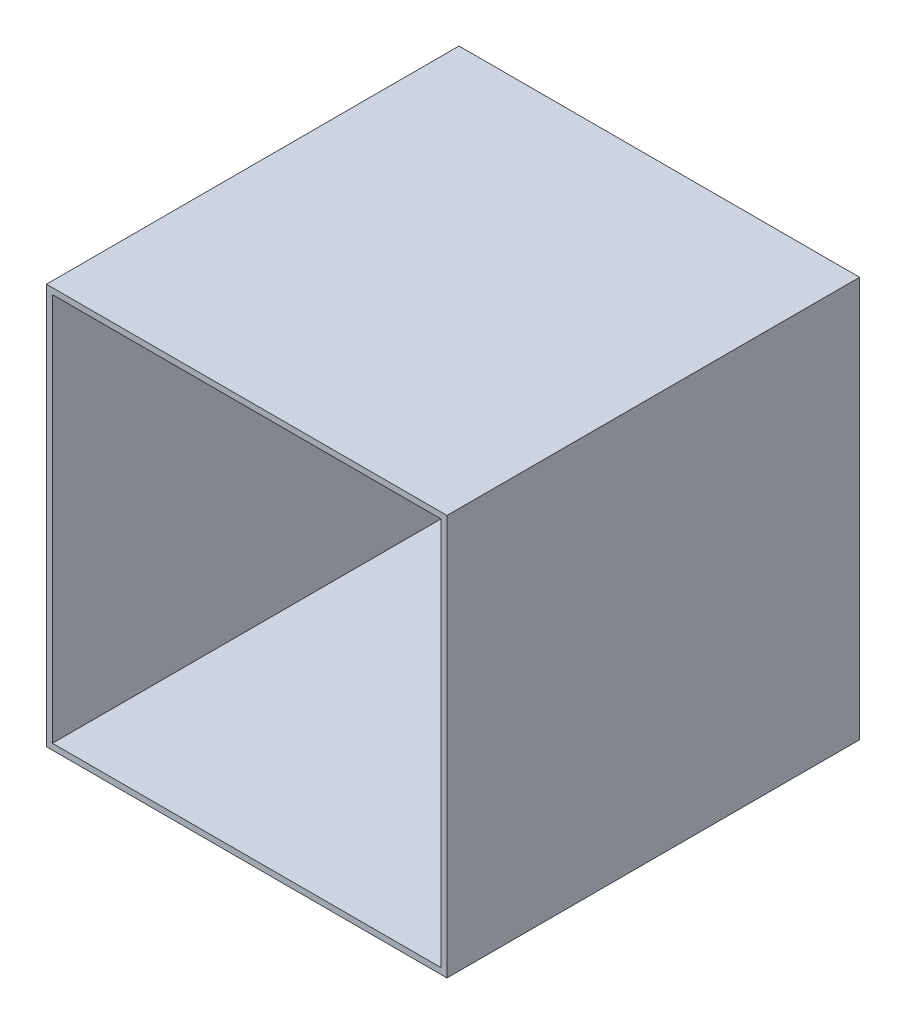
ISO-10303-21;
HEADER;
FILE_DESCRIPTION(('STEP AP214'),'2;1');
FILE_NAME('part.step','',(''),(''),'','','');
FILE_SCHEMA(('AUTOMOTIVE_DESIGN { 1 0 10303 214 1 1 1 1 }'));
ENDSEC;
DATA;
#1=APPLICATION_CONTEXT('core data for automotive mechanical design processes');
#2=APPLICATION_PROTOCOL_DEFINITION('international standard','automotive_design',2000,#1);
#3=PRODUCT_CONTEXT('',#1,'mechanical');
#4=PRODUCT('Part','Part','',(#3));
#5=PRODUCT_RELATED_PRODUCT_CATEGORY('part','',(#4));
#6=PRODUCT_DEFINITION_FORMATION('','',#4);
#7=PRODUCT_DEFINITION_CONTEXT('part definition',#1,'design');
#8=PRODUCT_DEFINITION('design','',#6,#7);
#9=PRODUCT_DEFINITION_SHAPE('','',#8);
#10=(LENGTH_UNIT() NAMED_UNIT(*) SI_UNIT(.MILLI.,.METRE.));
#11=(NAMED_UNIT(*) PLANE_ANGLE_UNIT() SI_UNIT($,.RADIAN.));
#12=(NAMED_UNIT(*) SI_UNIT($,.STERADIAN.) SOLID_ANGLE_UNIT());
#13=UNCERTAINTY_MEASURE_WITH_UNIT(LENGTH_MEASURE(1.E-05),#10,'distance_accuracy_value','');
#14=(GEOMETRIC_REPRESENTATION_CONTEXT(3) GLOBAL_UNCERTAINTY_ASSIGNED_CONTEXT((#13)) GLOBAL_UNIT_ASSIGNED_CONTEXT((#10,
#11,#12)) REPRESENTATION_CONTEXT('',''));
#15=CARTESIAN_POINT('',(0.,0.,0.));
#16=DIRECTION('',(0.,0.,1.));
#17=DIRECTION('',(1.,0.,0.));
#18=AXIS2_PLACEMENT_3D('',#15,#16,#17);
#19=CARTESIAN_POINT('',(-50.,50.,3.));
#20=DIRECTION('',(0.,-1.,0.));
#21=DIRECTION('',(1.,0.,0.));
#22=AXIS2_PLACEMENT_3D('',#19,#20,#21);
#23=PLANE('',#22);
#24=DIRECTION('',(-1.,0.,0.));
#25=VECTOR('',#24,1.);
#26=CARTESIAN_POINT('',(-50.,50.,0.));
#27=LINE('',#26,#25);
#28=CARTESIAN_POINT('',(50.,50.,0.));
#29=VERTEX_POINT('',#28);
#30=CARTESIAN_POINT('',(-50.,50.,0.));
#31=VERTEX_POINT('',#30);
#32=EDGE_CURVE('E255',#29,#31,#27,.T.);
#33=ORIENTED_EDGE('',*,*,#32,.T.);
#34=DIRECTION('',(0.,0.,-1.));
#35=VECTOR('',#34,1.);
#36=CARTESIAN_POINT('',(-50.,50.,3.));
#37=LINE('',#36,#35);
#38=CARTESIAN_POINT('',(-50.,50.,103.));
#39=VERTEX_POINT('',#38);
#40=EDGE_CURVE('E275',#39,#31,#37,.T.);
#41=ORIENTED_EDGE('',*,*,#40,.F.);
#42=DIRECTION('',(-1.,0.,0.));
#43=VECTOR('',#42,1.);
#44=CARTESIAN_POINT('',(-50.,50.,103.));
#45=LINE('',#44,#43);
#46=CARTESIAN_POINT('',(50.,50.,103.));
#47=VERTEX_POINT('',#46);
#48=EDGE_CURVE('E244',#47,#39,#45,.T.);
#49=ORIENTED_EDGE('',*,*,#48,.F.);
#50=DIRECTION('',(0.,0.,-1.));
#51=VECTOR('',#50,1.);
#52=CARTESIAN_POINT('',(50.,50.,3.));
#53=LINE('',#52,#51);
#54=EDGE_CURVE('E263',#47,#29,#53,.T.);
#55=ORIENTED_EDGE('',*,*,#54,.T.);
#56=EDGE_LOOP('',(#33,#41,#49,#55));
#57=FACE_BOUND('',#56,.T.);
#58=ADVANCED_FACE('F39',(#57),#23,.F.);
#59=CARTESIAN_POINT('',(-50.,-50.,3.));
#60=DIRECTION('',(1.,0.,0.));
#61=DIRECTION('',(0.,0.,-1.));
#62=AXIS2_PLACEMENT_3D('',#59,#60,#61);
#63=PLANE('',#62);
#64=DIRECTION('',(0.,-1.,0.));
#65=VECTOR('',#64,1.);
#66=CARTESIAN_POINT('',(-50.,-50.,0.));
#67=LINE('',#66,#65);
#68=CARTESIAN_POINT('',(-50.,-50.,0.));
#69=VERTEX_POINT('',#68);
#70=EDGE_CURVE('E260',#31,#69,#67,.T.);
#71=ORIENTED_EDGE('',*,*,#70,.T.);
#72=DIRECTION('',(0.,0.,-1.));
#73=VECTOR('',#72,1.);
#74=CARTESIAN_POINT('',(-50.,-50.,3.));
#75=LINE('',#74,#73);
#76=CARTESIAN_POINT('',(-50.,-50.,103.));
#77=VERTEX_POINT('',#76);
#78=EDGE_CURVE('E267',#77,#69,#75,.T.);
#79=ORIENTED_EDGE('',*,*,#78,.F.);
#80=DIRECTION('',(0.,-1.,0.));
#81=VECTOR('',#80,1.);
#82=CARTESIAN_POINT('',(-50.,50.,103.));
#83=LINE('',#82,#81);
#84=EDGE_CURVE('E247',#39,#77,#83,.T.);
#85=ORIENTED_EDGE('',*,*,#84,.F.);
#86=ORIENTED_EDGE('',*,*,#40,.T.);
#87=EDGE_LOOP('',(#71,#79,#85,#86));
#88=FACE_BOUND('',#87,.T.);
#89=ADVANCED_FACE('F317',(#88),#63,.F.);
#90=CARTESIAN_POINT('',(-50.,-50.,3.));
#91=DIRECTION('',(0.,1.,0.));
#92=DIRECTION('',(0.,0.,1.));
#93=AXIS2_PLACEMENT_3D('',#90,#91,#92);
#94=PLANE('',#93);
#95=DIRECTION('',(1.,0.,0.));
#96=VECTOR('',#95,1.);
#97=CARTESIAN_POINT('',(19.7957521891708,-50.,6.44000000000001));
#98=LINE('',#97,#96);
#99=CARTESIAN_POINT('',(19.7957521891708,-50.,6.44000000000001));
#100=VERTEX_POINT('',#99);
#101=CARTESIAN_POINT('',(26.8557521891708,-50.,6.44000000000001));
#102=VERTEX_POINT('',#101);
#103=EDGE_CURVE('E162',#100,#102,#98,.T.);
#104=ORIENTED_EDGE('',*,*,#103,.F.);
#105=CARTESIAN_POINT('',(19.7957521891708,-50.,7.72000000000001));
#106=DIRECTION('',(0.,-1.,0.));
#107=DIRECTION('',(0.,0.,-1.));
#108=AXIS2_PLACEMENT_3D('',#105,#106,#107);
#109=CIRCLE('',#108,1.28);
#110=CARTESIAN_POINT('',(19.7957521891708,-50.,9.00000000000001));
#111=VERTEX_POINT('',#110);
#112=EDGE_CURVE('E52',#111,#100,#109,.T.);
#113=ORIENTED_EDGE('',*,*,#112,.F.);
#114=DIRECTION('',(-1.,0.,0.));
#115=VECTOR('',#114,1.);
#116=CARTESIAN_POINT('',(19.7957521891708,-50.,9.00000000000001));
#117=LINE('',#116,#115);
#118=CARTESIAN_POINT('',(26.8557521891708,-50.,9.00000000000001));
#119=VERTEX_POINT('',#118);
#120=EDGE_CURVE('E168',#119,#111,#117,.T.);
#121=ORIENTED_EDGE('',*,*,#120,.F.);
#122=CARTESIAN_POINT('',(26.8557521891708,-50.,7.72000000000001));
#123=DIRECTION('',(0.,-1.,0.));
#124=DIRECTION('',(0.,0.,-1.));
#125=AXIS2_PLACEMENT_3D('',#122,#123,#124);
#126=CIRCLE('',#125,1.28);
#127=EDGE_CURVE('E152',#102,#119,#126,.T.);
#128=ORIENTED_EDGE('',*,*,#127,.F.);
#129=EDGE_LOOP('',(#104,#113,#121,#128));
#130=FACE_BOUND('',#129,.T.);
#131=DIRECTION('',(0.,0.,-1.));
#132=VECTOR('',#131,1.);
#133=CARTESIAN_POINT('',(-12.6584240264876,-50.,4.3));
#134=LINE('',#133,#132);
#135=CARTESIAN_POINT('',(-12.6584240264876,-50.,18.));
#136=VERTEX_POINT('',#135);
#137=CARTESIAN_POINT('',(-12.6584240264876,-50.,4.3));
#138=VERTEX_POINT('',#137);
#139=EDGE_CURVE('E182',#136,#138,#134,.T.);
#140=ORIENTED_EDGE('',*,*,#139,.F.);
#141=DIRECTION('',(-1.,0.,0.));
#142=VECTOR('',#141,1.);
#143=CARTESIAN_POINT('',(-12.6584240264876,-50.,18.));
#144=LINE('',#143,#142);
#145=CARTESIAN_POINT('',(6.14157597351235,-50.,18.));
#146=VERTEX_POINT('',#145);
#147=EDGE_CURVE('E179',#146,#136,#144,.T.);
#148=ORIENTED_EDGE('',*,*,#147,.F.);
#149=DIRECTION('',(0.,0.,1.));
#150=VECTOR('',#149,1.);
#151=CARTESIAN_POINT('',(6.14157597351235,-50.,4.3));
#152=LINE('',#151,#150);
#153=CARTESIAN_POINT('',(6.14157597351235,-50.,4.3));
#154=VERTEX_POINT('',#153);
#155=EDGE_CURVE('E190',#154,#146,#152,.T.);
#156=ORIENTED_EDGE('',*,*,#155,.F.);
#157=DIRECTION('',(1.,0.,0.));
#158=VECTOR('',#157,1.);
#159=CARTESIAN_POINT('',(-12.6584240264876,-50.,4.3));
#160=LINE('',#159,#158);
#161=EDGE_CURVE('E184',#138,#154,#160,.T.);
#162=ORIENTED_EDGE('',*,*,#161,.F.);
#163=EDGE_LOOP('',(#140,#148,#156,#162));
#164=FACE_BOUND('',#163,.T.);
#165=CARTESIAN_POINT('',(-45.6938233151262,-50.,4.57120848716811));
#166=DIRECTION('',(0.,-1.,0.));
#167=DIRECTION('',(0.,0.,-1.));
#168=AXIS2_PLACEMENT_3D('',#165,#166,#167);
#169=CIRCLE('',#168,0.999999999999998);
#170=CARTESIAN_POINT('',(-45.6938233151262,-50.,3.57120848716811));
#171=VERTEX_POINT('',#170);
#172=EDGE_CURVE('E199',#171,#171,#169,.T.);
#173=ORIENTED_EDGE('',*,*,#172,.F.);
#174=EDGE_LOOP('',(#173));
#175=FACE_BOUND('',#174,.T.);
#176=CARTESIAN_POINT('',(-38.4383851536027,-50.,4.57120848716811));
#177=DIRECTION('',(0.,-1.,0.));
#178=DIRECTION('',(0.,0.,-1.));
#179=AXIS2_PLACEMENT_3D('',#176,#177,#178);
#180=CIRCLE('',#179,0.999999999999998);
#181=CARTESIAN_POINT('',(-38.4383851536027,-50.,3.57120848716811));
#182=VERTEX_POINT('',#181);
#183=EDGE_CURVE('E204',#182,#182,#180,.T.);
#184=ORIENTED_EDGE('',*,*,#183,.F.);
#185=EDGE_LOOP('',(#184));
#186=FACE_BOUND('',#185,.T.);
#187=CARTESIAN_POINT('',(-29.7936077696599,-50.,4.57120848716811));
#188=DIRECTION('',(0.,-1.,0.));
#189=DIRECTION('',(0.,0.,-1.));
#190=AXIS2_PLACEMENT_3D('',#187,#188,#189);
#191=CIRCLE('',#190,1.);
#192=CARTESIAN_POINT('',(-29.7936077696599,-50.,3.57120848716811));
#193=VERTEX_POINT('',#192);
#194=EDGE_CURVE('E192',#193,#193,#191,.T.);
#195=ORIENTED_EDGE('',*,*,#194,.F.);
#196=EDGE_LOOP('',(#195));
#197=FACE_BOUND('',#196,.T.);
#198=DIRECTION('',(1.,0.,0.));
#199=VECTOR('',#198,1.);
#200=CARTESIAN_POINT('',(-50.,-50.,0.));
#201=LINE('',#200,#199);
#202=CARTESIAN_POINT('',(50.,-50.,0.));
#203=VERTEX_POINT('',#202);
#204=EDGE_CURVE('E259',#69,#203,#201,.T.);
#205=ORIENTED_EDGE('',*,*,#204,.T.);
#206=DIRECTION('',(0.,0.,-1.));
#207=VECTOR('',#206,1.);
#208=CARTESIAN_POINT('',(50.,-50.,3.));
#209=LINE('',#208,#207);
#210=CARTESIAN_POINT('',(50.,-50.,103.));
#211=VERTEX_POINT('',#210);
#212=EDGE_CURVE('E266',#211,#203,#209,.T.);
#213=ORIENTED_EDGE('',*,*,#212,.F.);
#214=DIRECTION('',(1.,0.,0.));
#215=VECTOR('',#214,1.);
#216=CARTESIAN_POINT('',(-50.,-50.,103.));
#217=LINE('',#216,#215);
#218=EDGE_CURVE('E253',#77,#211,#217,.T.);
#219=ORIENTED_EDGE('',*,*,#218,.F.);
#220=ORIENTED_EDGE('',*,*,#78,.T.);
#221=EDGE_LOOP('',(#205,#213,#219,#220));
#222=FACE_BOUND('',#221,.T.);
#223=ADVANCED_FACE('F170',(#130,#164,#175,#186,#197,#222),#94,.F.);
#224=CARTESIAN_POINT('',(50.,-50.,3.));
#225=DIRECTION('',(-1.,0.,0.));
#226=DIRECTION('',(0.,0.,1.));
#227=AXIS2_PLACEMENT_3D('',#224,#225,#226);
#228=PLANE('',#227);
#229=DIRECTION('',(0.,1.,0.));
#230=VECTOR('',#229,1.);
#231=CARTESIAN_POINT('',(50.,-50.,0.));
#232=LINE('',#231,#230);
#233=EDGE_CURVE('E261',#203,#29,#232,.T.);
#234=ORIENTED_EDGE('',*,*,#233,.T.);
#235=ORIENTED_EDGE('',*,*,#54,.F.);
#236=DIRECTION('',(0.,1.,0.));
#237=VECTOR('',#236,1.);
#238=CARTESIAN_POINT('',(50.,50.,103.));
#239=LINE('',#238,#237);
#240=EDGE_CURVE('E237',#211,#47,#239,.T.);
#241=ORIENTED_EDGE('',*,*,#240,.F.);
#242=ORIENTED_EDGE('',*,*,#212,.T.);
#243=EDGE_LOOP('',(#234,#235,#241,#242));
#244=FACE_BOUND('',#243,.T.);
#245=ADVANCED_FACE('F338',(#244),#228,.F.);
#246=CARTESIAN_POINT('',(0.,0.,0.));
#247=DIRECTION('',(0.,0.,1.));
#248=DIRECTION('',(1.,0.,0.));
#249=AXIS2_PLACEMENT_3D('',#246,#247,#248);
#250=PLANE('',#249);
#251=ORIENTED_EDGE('',*,*,#32,.F.);
#252=ORIENTED_EDGE('',*,*,#233,.F.);
#253=ORIENTED_EDGE('',*,*,#204,.F.);
#254=ORIENTED_EDGE('',*,*,#70,.F.);
#255=EDGE_LOOP('',(#251,#252,#253,#254));
#256=FACE_BOUND('',#255,.T.);
#257=ADVANCED_FACE('F329',(#256),#250,.F.);
#258=CARTESIAN_POINT('',(0.,0.,103.));
#259=DIRECTION('',(0.,0.,1.));
#260=DIRECTION('',(1.,0.,0.));
#261=AXIS2_PLACEMENT_3D('',#258,#259,#260);
#262=PLANE('',#261);
#263=DIRECTION('',(0.,1.,0.));
#264=VECTOR('',#263,1.);
#265=CARTESIAN_POINT('',(48.5,48.5,103.));
#266=LINE('',#265,#264);
#267=CARTESIAN_POINT('',(48.5,-48.5,103.));
#268=VERTEX_POINT('',#267);
#269=CARTESIAN_POINT('',(48.5,48.5,103.));
#270=VERTEX_POINT('',#269);
#271=EDGE_CURVE('E224',#268,#270,#266,.T.);
#272=ORIENTED_EDGE('',*,*,#271,.F.);
#273=DIRECTION('',(1.,0.,0.));
#274=VECTOR('',#273,1.);
#275=CARTESIAN_POINT('',(-48.5,-48.5,103.));
#276=LINE('',#275,#274);
#277=CARTESIAN_POINT('',(-48.5,-48.5,103.));
#278=VERTEX_POINT('',#277);
#279=EDGE_CURVE('E213',#278,#268,#276,.T.);
#280=ORIENTED_EDGE('',*,*,#279,.F.);
#281=DIRECTION('',(0.,-1.,0.));
#282=VECTOR('',#281,1.);
#283=CARTESIAN_POINT('',(-48.5,48.5,103.));
#284=LINE('',#283,#282);
#285=CARTESIAN_POINT('',(-48.5,48.5,103.));
#286=VERTEX_POINT('',#285);
#287=EDGE_CURVE('E228',#286,#278,#284,.T.);
#288=ORIENTED_EDGE('',*,*,#287,.F.);
#289=DIRECTION('',(-1.,0.,0.));
#290=VECTOR('',#289,1.);
#291=CARTESIAN_POINT('',(-48.5,48.5,103.));
#292=LINE('',#291,#290);
#293=EDGE_CURVE('E223',#270,#286,#292,.T.);
#294=ORIENTED_EDGE('',*,*,#293,.F.);
#295=EDGE_LOOP('',(#272,#280,#288,#294));
#296=FACE_BOUND('',#295,.T.);
#297=ORIENTED_EDGE('',*,*,#240,.T.);
#298=ORIENTED_EDGE('',*,*,#48,.T.);
#299=ORIENTED_EDGE('',*,*,#84,.T.);
#300=ORIENTED_EDGE('',*,*,#218,.T.);
#301=EDGE_LOOP('',(#297,#298,#299,#300));
#302=FACE_BOUND('',#301,.T.);
#303=ADVANCED_FACE('F333',(#296,#302),#262,.T.);
#304=CARTESIAN_POINT('',(48.5,48.5,3.));
#305=DIRECTION('',(1.,0.,0.));
#306=DIRECTION('',(0.,1.,0.));
#307=AXIS2_PLACEMENT_3D('',#304,#305,#306);
#308=PLANE('',#307);
#309=ORIENTED_EDGE('',*,*,#271,.T.);
#310=DIRECTION('',(0.,0.,1.));
#311=VECTOR('',#310,1.);
#312=CARTESIAN_POINT('',(48.5,48.5,3.));
#313=LINE('',#312,#311);
#314=CARTESIAN_POINT('',(48.5,48.5,3.));
#315=VERTEX_POINT('',#314);
#316=EDGE_CURVE('E225',#315,#270,#313,.T.);
#317=ORIENTED_EDGE('',*,*,#316,.F.);
#318=DIRECTION('',(0.,1.,0.));
#319=VECTOR('',#318,1.);
#320=CARTESIAN_POINT('',(48.5,48.5,3.));
#321=LINE('',#320,#319);
#322=CARTESIAN_POINT('',(48.5,-48.5,3.));
#323=VERTEX_POINT('',#322);
#324=EDGE_CURVE('E207',#323,#315,#321,.T.);
#325=ORIENTED_EDGE('',*,*,#324,.F.);
#326=DIRECTION('',(0.,0.,1.));
#327=VECTOR('',#326,1.);
#328=CARTESIAN_POINT('',(48.5,-48.5,3.));
#329=LINE('',#328,#327);
#330=EDGE_CURVE('E235',#323,#268,#329,.T.);
#331=ORIENTED_EDGE('',*,*,#330,.T.);
#332=EDGE_LOOP('',(#309,#317,#325,#331));
#333=FACE_BOUND('',#332,.T.);
#334=ADVANCED_FACE('F348',(#333),#308,.F.);
#335=CARTESIAN_POINT('',(-48.5,-48.5,3.));
#336=DIRECTION('',(0.,-1.,0.));
#337=DIRECTION('',(0.,0.,-1.));
#338=AXIS2_PLACEMENT_3D('',#335,#336,#337);
#339=PLANE('',#338);
#340=DIRECTION('',(-1.,0.,0.));
#341=VECTOR('',#340,1.);
#342=CARTESIAN_POINT('',(-48.5,-48.5,9.00000000000001));
#343=LINE('',#342,#341);
#344=CARTESIAN_POINT('',(26.8557521891708,-48.5,9.00000000000001));
#345=VERTEX_POINT('',#344);
#346=CARTESIAN_POINT('',(19.7957521891708,-48.5,9.00000000000001));
#347=VERTEX_POINT('',#346);
#348=EDGE_CURVE('E46',#345,#347,#343,.T.);
#349=ORIENTED_EDGE('',*,*,#348,.T.);
#350=CARTESIAN_POINT('',(19.7957521891708,-48.5,7.72000000000001));
#351=DIRECTION('',(0.,-1.,0.));
#352=DIRECTION('',(0.,0.,-1.));
#353=AXIS2_PLACEMENT_3D('',#350,#351,#352);
#354=CIRCLE('',#353,1.28);
#355=CARTESIAN_POINT('',(19.7957521891708,-48.5,6.44000000000001));
#356=VERTEX_POINT('',#355);
#357=EDGE_CURVE('E11',#347,#356,#354,.T.);
#358=ORIENTED_EDGE('',*,*,#357,.T.);
#359=DIRECTION('',(1.,0.,0.));
#360=VECTOR('',#359,1.);
#361=CARTESIAN_POINT('',(-48.5,-48.5,6.44000000000001));
#362=LINE('',#361,#360);
#363=CARTESIAN_POINT('',(26.8557521891708,-48.5,6.44000000000001));
#364=VERTEX_POINT('',#363);
#365=EDGE_CURVE('E294',#356,#364,#362,.T.);
#366=ORIENTED_EDGE('',*,*,#365,.T.);
#367=CARTESIAN_POINT('',(26.8557521891708,-48.5,7.72000000000001));
#368=DIRECTION('',(0.,-1.,0.));
#369=DIRECTION('',(0.,0.,-1.));
#370=AXIS2_PLACEMENT_3D('',#367,#368,#369);
#371=CIRCLE('',#370,1.28);
#372=EDGE_CURVE('E160',#364,#345,#371,.T.);
#373=ORIENTED_EDGE('',*,*,#372,.T.);
#374=EDGE_LOOP('',(#349,#358,#366,#373));
#375=FACE_BOUND('',#374,.T.);
#376=DIRECTION('',(0.,0.,1.));
#377=VECTOR('',#376,1.);
#378=CARTESIAN_POINT('',(6.14157597351235,-48.5,3.));
#379=LINE('',#378,#377);
#380=CARTESIAN_POINT('',(6.14157597351235,-48.5,4.3));
#381=VERTEX_POINT('',#380);
#382=CARTESIAN_POINT('',(6.14157597351235,-48.5,18.));
#383=VERTEX_POINT('',#382);
#384=EDGE_CURVE('E287',#381,#383,#379,.T.);
#385=ORIENTED_EDGE('',*,*,#384,.T.);
#386=DIRECTION('',(-1.,0.,0.));
#387=VECTOR('',#386,1.);
#388=CARTESIAN_POINT('',(-48.5,-48.5,18.));
#389=LINE('',#388,#387);
#390=CARTESIAN_POINT('',(-12.6584240264876,-48.5,18.));
#391=VERTEX_POINT('',#390);
#392=EDGE_CURVE('E292',#383,#391,#389,.T.);
#393=ORIENTED_EDGE('',*,*,#392,.T.);
#394=DIRECTION('',(0.,0.,-1.));
#395=VECTOR('',#394,1.);
#396=CARTESIAN_POINT('',(-12.6584240264876,-48.5,3.));
#397=LINE('',#396,#395);
#398=CARTESIAN_POINT('',(-12.6584240264876,-48.5,4.3));
#399=VERTEX_POINT('',#398);
#400=EDGE_CURVE('E274',#391,#399,#397,.T.);
#401=ORIENTED_EDGE('',*,*,#400,.T.);
#402=DIRECTION('',(1.,0.,0.));
#403=VECTOR('',#402,1.);
#404=CARTESIAN_POINT('',(-48.5,-48.5,4.3));
#405=LINE('',#404,#403);
#406=EDGE_CURVE('E284',#399,#381,#405,.T.);
#407=ORIENTED_EDGE('',*,*,#406,.T.);
#408=EDGE_LOOP('',(#385,#393,#401,#407));
#409=FACE_BOUND('',#408,.T.);
#410=CARTESIAN_POINT('',(-45.6938233151262,-48.5,4.57120848716811));
#411=DIRECTION('',(0.,-1.,0.));
#412=DIRECTION('',(0.,0.,-1.));
#413=AXIS2_PLACEMENT_3D('',#410,#411,#412);
#414=CIRCLE('',#413,0.999999999999998);
#415=CARTESIAN_POINT('',(-45.6938233151262,-48.5,3.57120848716811));
#416=VERTEX_POINT('',#415);
#417=EDGE_CURVE('E226',#416,#416,#414,.T.);
#418=ORIENTED_EDGE('',*,*,#417,.T.);
#419=EDGE_LOOP('',(#418));
#420=FACE_BOUND('',#419,.T.);
#421=CARTESIAN_POINT('',(-38.4383851536027,-48.5,4.57120848716811));
#422=DIRECTION('',(0.,-1.,0.));
#423=DIRECTION('',(0.,0.,-1.));
#424=AXIS2_PLACEMENT_3D('',#421,#422,#423);
#425=CIRCLE('',#424,0.999999999999998);
#426=CARTESIAN_POINT('',(-38.4383851536027,-48.5,3.57120848716811));
#427=VERTEX_POINT('',#426);
#428=EDGE_CURVE('E279',#427,#427,#425,.T.);
#429=ORIENTED_EDGE('',*,*,#428,.T.);
#430=EDGE_LOOP('',(#429));
#431=FACE_BOUND('',#430,.T.);
#432=CARTESIAN_POINT('',(-29.7936077696599,-48.5,4.57120848716811));
#433=DIRECTION('',(0.,-1.,0.));
#434=DIRECTION('',(0.,0.,-1.));
#435=AXIS2_PLACEMENT_3D('',#432,#433,#434);
#436=CIRCLE('',#435,1.);
#437=CARTESIAN_POINT('',(-29.7936077696599,-48.5,3.57120848716811));
#438=VERTEX_POINT('',#437);
#439=EDGE_CURVE('E201',#438,#438,#436,.T.);
#440=ORIENTED_EDGE('',*,*,#439,.T.);
#441=EDGE_LOOP('',(#440));
#442=FACE_BOUND('',#441,.T.);
#443=ORIENTED_EDGE('',*,*,#279,.T.);
#444=ORIENTED_EDGE('',*,*,#330,.F.);
#445=DIRECTION('',(1.,0.,0.));
#446=VECTOR('',#445,1.);
#447=CARTESIAN_POINT('',(-48.5,-48.5,3.));
#448=LINE('',#447,#446);
#449=CARTESIAN_POINT('',(-48.5,-48.5,3.));
#450=VERTEX_POINT('',#449);
#451=EDGE_CURVE('E218',#450,#323,#448,.T.);
#452=ORIENTED_EDGE('',*,*,#451,.F.);
#453=DIRECTION('',(0.,0.,1.));
#454=VECTOR('',#453,1.);
#455=CARTESIAN_POINT('',(-48.5,-48.5,3.));
#456=LINE('',#455,#454);
#457=EDGE_CURVE('E240',#450,#278,#456,.T.);
#458=ORIENTED_EDGE('',*,*,#457,.T.);
#459=EDGE_LOOP('',(#443,#444,#452,#458));
#460=FACE_BOUND('',#459,.T.);
#461=ADVANCED_FACE('F297',(#375,#409,#420,#431,#442,#460),#339,.F.);
#462=CARTESIAN_POINT('',(-48.5,48.5,3.));
#463=DIRECTION('',(-1.,0.,0.));
#464=DIRECTION('',(0.,-1.,0.));
#465=AXIS2_PLACEMENT_3D('',#462,#463,#464);
#466=PLANE('',#465);
#467=ORIENTED_EDGE('',*,*,#287,.T.);
#468=ORIENTED_EDGE('',*,*,#457,.F.);
#469=DIRECTION('',(0.,-1.,0.));
#470=VECTOR('',#469,1.);
#471=CARTESIAN_POINT('',(-48.5,48.5,3.));
#472=LINE('',#471,#470);
#473=CARTESIAN_POINT('',(-48.5,48.5,3.));
#474=VERTEX_POINT('',#473);
#475=EDGE_CURVE('E216',#474,#450,#472,.T.);
#476=ORIENTED_EDGE('',*,*,#475,.F.);
#477=DIRECTION('',(0.,0.,1.));
#478=VECTOR('',#477,1.);
#479=CARTESIAN_POINT('',(-48.5,48.5,3.));
#480=LINE('',#479,#478);
#481=EDGE_CURVE('E239',#474,#286,#480,.T.);
#482=ORIENTED_EDGE('',*,*,#481,.T.);
#483=EDGE_LOOP('',(#467,#468,#476,#482));
#484=FACE_BOUND('',#483,.T.);
#485=ADVANCED_FACE('F360',(#484),#466,.F.);
#486=CARTESIAN_POINT('',(-48.5,48.5,3.));
#487=DIRECTION('',(0.,1.,0.));
#488=DIRECTION('',(0.,0.,1.));
#489=AXIS2_PLACEMENT_3D('',#486,#487,#488);
#490=PLANE('',#489);
#491=ORIENTED_EDGE('',*,*,#293,.T.);
#492=ORIENTED_EDGE('',*,*,#481,.F.);
#493=DIRECTION('',(-1.,0.,0.));
#494=VECTOR('',#493,1.);
#495=CARTESIAN_POINT('',(-48.5,48.5,3.));
#496=LINE('',#495,#494);
#497=EDGE_CURVE('E215',#315,#474,#496,.T.);
#498=ORIENTED_EDGE('',*,*,#497,.F.);
#499=ORIENTED_EDGE('',*,*,#316,.T.);
#500=EDGE_LOOP('',(#491,#492,#498,#499));
#501=FACE_BOUND('',#500,.T.);
#502=ADVANCED_FACE('F354',(#501),#490,.F.);
#503=CARTESIAN_POINT('',(0.,0.,3.));
#504=DIRECTION('',(0.,0.,1.));
#505=DIRECTION('',(1.,0.,0.));
#506=AXIS2_PLACEMENT_3D('',#503,#504,#505);
#507=PLANE('',#506);
#508=ORIENTED_EDGE('',*,*,#324,.T.);
#509=ORIENTED_EDGE('',*,*,#497,.T.);
#510=ORIENTED_EDGE('',*,*,#475,.T.);
#511=ORIENTED_EDGE('',*,*,#451,.T.);
#512=EDGE_LOOP('',(#508,#509,#510,#511));
#513=FACE_BOUND('',#512,.T.);
#514=ADVANCED_FACE('F357',(#513),#507,.T.);
#515=CARTESIAN_POINT('',(-29.7936077696599,-47.,4.57120848716811));
#516=DIRECTION('',(0.,-1.,0.));
#517=DIRECTION('',(0.,0.,-1.));
#518=AXIS2_PLACEMENT_3D('',#515,#516,#517);
#519=CYLINDRICAL_SURFACE('',#518,1.);
#520=ORIENTED_EDGE('',*,*,#194,.T.);
#521=EDGE_LOOP('',(#520));
#522=FACE_BOUND('',#521,.T.);
#523=ORIENTED_EDGE('',*,*,#439,.F.);
#524=EDGE_LOOP('',(#523));
#525=FACE_BOUND('',#524,.T.);
#526=ADVANCED_FACE('F370',(#522,#525),#519,.F.);
#527=CARTESIAN_POINT('',(-38.4383851536027,-47.,4.57120848716811));
#528=DIRECTION('',(0.,-1.,0.));
#529=DIRECTION('',(0.,0.,-1.));
#530=AXIS2_PLACEMENT_3D('',#527,#528,#529);
#531=CYLINDRICAL_SURFACE('',#530,0.999999999999998);
#532=ORIENTED_EDGE('',*,*,#183,.T.);
#533=EDGE_LOOP('',(#532));
#534=FACE_BOUND('',#533,.T.);
#535=ORIENTED_EDGE('',*,*,#428,.F.);
#536=EDGE_LOOP('',(#535));
#537=FACE_BOUND('',#536,.T.);
#538=ADVANCED_FACE('F371',(#534,#537),#531,.F.);
#539=CARTESIAN_POINT('',(-45.6938233151262,-47.,4.57120848716811));
#540=DIRECTION('',(0.,-1.,0.));
#541=DIRECTION('',(0.,0.,-1.));
#542=AXIS2_PLACEMENT_3D('',#539,#540,#541);
#543=CYLINDRICAL_SURFACE('',#542,0.999999999999998);
#544=ORIENTED_EDGE('',*,*,#172,.T.);
#545=EDGE_LOOP('',(#544));
#546=FACE_BOUND('',#545,.T.);
#547=ORIENTED_EDGE('',*,*,#417,.F.);
#548=EDGE_LOOP('',(#547));
#549=FACE_BOUND('',#548,.T.);
#550=ADVANCED_FACE('F374',(#546,#549),#543,.F.);
#551=CARTESIAN_POINT('',(-12.6584240264876,-47.,18.));
#552=DIRECTION('',(0.,0.,1.));
#553=DIRECTION('',(1.,0.,0.));
#554=AXIS2_PLACEMENT_3D('',#551,#552,#553);
#555=PLANE('',#554);
#556=DIRECTION('',(0.,-1.,0.));
#557=VECTOR('',#556,1.);
#558=CARTESIAN_POINT('',(6.14157597351235,-47.,18.));
#559=LINE('',#558,#557);
#560=EDGE_CURVE('E193',#383,#146,#559,.T.);
#561=ORIENTED_EDGE('',*,*,#560,.T.);
#562=ORIENTED_EDGE('',*,*,#147,.T.);
#563=DIRECTION('',(0.,-1.,0.));
#564=VECTOR('',#563,1.);
#565=CARTESIAN_POINT('',(-12.6584240264876,-47.,18.));
#566=LINE('',#565,#564);
#567=EDGE_CURVE('E189',#391,#136,#566,.T.);
#568=ORIENTED_EDGE('',*,*,#567,.F.);
#569=ORIENTED_EDGE('',*,*,#392,.F.);
#570=EDGE_LOOP('',(#561,#562,#568,#569));
#571=FACE_BOUND('',#570,.T.);
#572=ADVANCED_FACE('F377',(#571),#555,.F.);
#573=CARTESIAN_POINT('',(6.14157597351235,-47.,4.3));
#574=DIRECTION('',(1.,0.,0.));
#575=DIRECTION('',(0.,0.,-1.));
#576=AXIS2_PLACEMENT_3D('',#573,#574,#575);
#577=PLANE('',#576);
#578=DIRECTION('',(0.,-1.,0.));
#579=VECTOR('',#578,1.);
#580=CARTESIAN_POINT('',(6.14157597351235,-47.,4.3));
#581=LINE('',#580,#579);
#582=EDGE_CURVE('E195',#381,#154,#581,.T.);
#583=ORIENTED_EDGE('',*,*,#582,.T.);
#584=ORIENTED_EDGE('',*,*,#155,.T.);
#585=ORIENTED_EDGE('',*,*,#560,.F.);
#586=ORIENTED_EDGE('',*,*,#384,.F.);
#587=EDGE_LOOP('',(#583,#584,#585,#586));
#588=FACE_BOUND('',#587,.T.);
#589=ADVANCED_FACE('F385',(#588),#577,.F.);
#590=CARTESIAN_POINT('',(-12.6584240264876,-47.,4.3));
#591=DIRECTION('',(0.,0.,-1.));
#592=DIRECTION('',(-1.,0.,0.));
#593=AXIS2_PLACEMENT_3D('',#590,#591,#592);
#594=PLANE('',#593);
#595=DIRECTION('',(0.,-1.,0.));
#596=VECTOR('',#595,1.);
#597=CARTESIAN_POINT('',(-12.6584240264876,-47.,4.3));
#598=LINE('',#597,#596);
#599=EDGE_CURVE('E198',#399,#138,#598,.T.);
#600=ORIENTED_EDGE('',*,*,#599,.T.);
#601=ORIENTED_EDGE('',*,*,#161,.T.);
#602=ORIENTED_EDGE('',*,*,#582,.F.);
#603=ORIENTED_EDGE('',*,*,#406,.F.);
#604=EDGE_LOOP('',(#600,#601,#602,#603));
#605=FACE_BOUND('',#604,.T.);
#606=ADVANCED_FACE('F311',(#605),#594,.F.);
#607=CARTESIAN_POINT('',(-12.6584240264876,-47.,4.3));
#608=DIRECTION('',(-1.,0.,0.));
#609=DIRECTION('',(0.,0.,1.));
#610=AXIS2_PLACEMENT_3D('',#607,#608,#609);
#611=PLANE('',#610);
#612=ORIENTED_EDGE('',*,*,#567,.T.);
#613=ORIENTED_EDGE('',*,*,#139,.T.);
#614=ORIENTED_EDGE('',*,*,#599,.F.);
#615=ORIENTED_EDGE('',*,*,#400,.F.);
#616=EDGE_LOOP('',(#612,#613,#614,#615));
#617=FACE_BOUND('',#616,.T.);
#618=ADVANCED_FACE('F301',(#617),#611,.F.);
#619=CARTESIAN_POINT('',(19.7957521891708,-47.,7.72000000000001));
#620=DIRECTION('',(0.,-1.,0.));
#621=DIRECTION('',(0.,0.,-1.));
#622=AXIS2_PLACEMENT_3D('',#619,#620,#621);
#623=CYLINDRICAL_SURFACE('',#622,1.28);
#624=DIRECTION('',(0.,-1.,0.));
#625=VECTOR('',#624,1.);
#626=CARTESIAN_POINT('',(19.7957521891708,-47.,9.00000000000001));
#627=LINE('',#626,#625);
#628=EDGE_CURVE('E174',#347,#111,#627,.T.);
#629=ORIENTED_EDGE('',*,*,#628,.T.);
#630=ORIENTED_EDGE('',*,*,#112,.T.);
#631=DIRECTION('',(0.,-1.,0.));
#632=VECTOR('',#631,1.);
#633=CARTESIAN_POINT('',(19.7957521891708,-47.,6.44000000000001));
#634=LINE('',#633,#632);
#635=EDGE_CURVE('E159',#356,#100,#634,.T.);
#636=ORIENTED_EDGE('',*,*,#635,.F.);
#637=ORIENTED_EDGE('',*,*,#357,.F.);
#638=EDGE_LOOP('',(#629,#630,#636,#637));
#639=FACE_BOUND('',#638,.T.);
#640=ADVANCED_FACE('F302',(#639),#623,.F.);
#641=CARTESIAN_POINT('',(19.7957521891708,-47.,9.00000000000001));
#642=DIRECTION('',(0.,0.,1.));
#643=DIRECTION('',(1.,0.,0.));
#644=AXIS2_PLACEMENT_3D('',#641,#642,#643);
#645=PLANE('',#644);
#646=DIRECTION('',(0.,-1.,0.));
#647=VECTOR('',#646,1.);
#648=CARTESIAN_POINT('',(26.8557521891708,-47.,9.00000000000001));
#649=LINE('',#648,#647);
#650=EDGE_CURVE('E157',#345,#119,#649,.T.);
#651=ORIENTED_EDGE('',*,*,#650,.T.);
#652=ORIENTED_EDGE('',*,*,#120,.T.);
#653=ORIENTED_EDGE('',*,*,#628,.F.);
#654=ORIENTED_EDGE('',*,*,#348,.F.);
#655=EDGE_LOOP('',(#651,#652,#653,#654));
#656=FACE_BOUND('',#655,.T.);
#657=ADVANCED_FACE('F304',(#656),#645,.F.);
#658=CARTESIAN_POINT('',(26.8557521891708,-47.,7.72000000000001));
#659=DIRECTION('',(0.,-1.,0.));
#660=DIRECTION('',(0.,0.,-1.));
#661=AXIS2_PLACEMENT_3D('',#658,#659,#660);
#662=CYLINDRICAL_SURFACE('',#661,1.28);
#663=DIRECTION('',(0.,-1.,0.));
#664=VECTOR('',#663,1.);
#665=CARTESIAN_POINT('',(26.8557521891708,-47.,6.44000000000001));
#666=LINE('',#665,#664);
#667=EDGE_CURVE('E61',#364,#102,#666,.T.);
#668=ORIENTED_EDGE('',*,*,#667,.T.);
#669=ORIENTED_EDGE('',*,*,#127,.T.);
#670=ORIENTED_EDGE('',*,*,#650,.F.);
#671=ORIENTED_EDGE('',*,*,#372,.F.);
#672=EDGE_LOOP('',(#668,#669,#670,#671));
#673=FACE_BOUND('',#672,.T.);
#674=ADVANCED_FACE('F151',(#673),#662,.F.);
#675=CARTESIAN_POINT('',(19.7957521891708,-47.,6.44000000000001));
#676=DIRECTION('',(0.,0.,-1.));
#677=DIRECTION('',(-1.,0.,0.));
#678=AXIS2_PLACEMENT_3D('',#675,#676,#677);
#679=PLANE('',#678);
#680=ORIENTED_EDGE('',*,*,#635,.T.);
#681=ORIENTED_EDGE('',*,*,#103,.T.);
#682=ORIENTED_EDGE('',*,*,#667,.F.);
#683=ORIENTED_EDGE('',*,*,#365,.F.);
#684=EDGE_LOOP('',(#680,#681,#682,#683));
#685=FACE_BOUND('',#684,.T.);
#686=ADVANCED_FACE('F163',(#685),#679,.F.);
#687=CLOSED_SHELL('',(#58,#89,#223,#245,#257,#303,#334,#461,#485,#502,#514,#526,#538,#550,#572,
#589,#606,#618,#640,#657,#674,#686));
#688=MANIFOLD_SOLID_BREP('B2',#687);
#689=ADVANCED_BREP_SHAPE_REPRESENTATION('',(#18,#688),#14);
#690=SHAPE_DEFINITION_REPRESENTATION(#9,#689);
ENDSEC;
END-ISO-10303-21;
